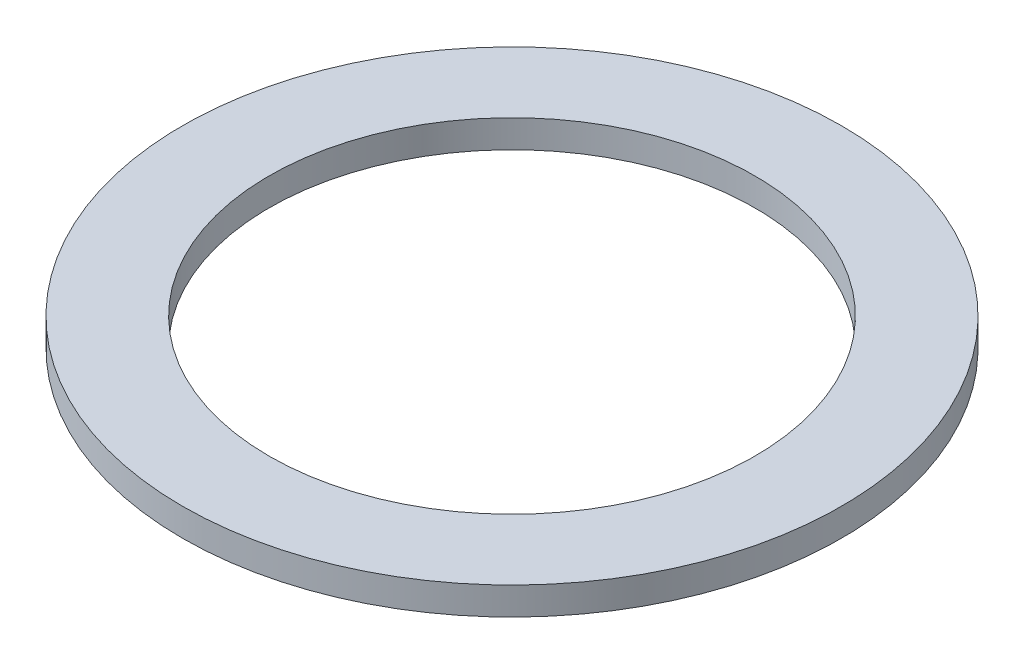
ISO-10303-21;
HEADER;
FILE_DESCRIPTION(('STEP AP214'),'2;1');
FILE_NAME('part.step','',(''),(''),'','','');
FILE_SCHEMA(('AUTOMOTIVE_DESIGN { 1 0 10303 214 1 1 1 1 }'));
ENDSEC;
DATA;
#1=APPLICATION_CONTEXT('core data for automotive mechanical design processes');
#2=APPLICATION_PROTOCOL_DEFINITION('international standard','automotive_design',2000,#1);
#3=PRODUCT_CONTEXT('',#1,'mechanical');
#4=PRODUCT('Part','Part','',(#3));
#5=PRODUCT_RELATED_PRODUCT_CATEGORY('part','',(#4));
#6=PRODUCT_DEFINITION_FORMATION('','',#4);
#7=PRODUCT_DEFINITION_CONTEXT('part definition',#1,'design');
#8=PRODUCT_DEFINITION('design','',#6,#7);
#9=PRODUCT_DEFINITION_SHAPE('','',#8);
#10=(LENGTH_UNIT() NAMED_UNIT(*) SI_UNIT(.MILLI.,.METRE.));
#11=(NAMED_UNIT(*) PLANE_ANGLE_UNIT() SI_UNIT($,.RADIAN.));
#12=(NAMED_UNIT(*) SI_UNIT($,.STERADIAN.) SOLID_ANGLE_UNIT());
#13=UNCERTAINTY_MEASURE_WITH_UNIT(LENGTH_MEASURE(1.E-05),#10,'distance_accuracy_value','');
#14=(GEOMETRIC_REPRESENTATION_CONTEXT(3) GLOBAL_UNCERTAINTY_ASSIGNED_CONTEXT((#13)) GLOBAL_UNIT_ASSIGNED_CONTEXT((#10,
#11,#12)) REPRESENTATION_CONTEXT('',''));
#15=CARTESIAN_POINT('',(0.,0.,0.));
#16=DIRECTION('',(0.,0.,1.));
#17=DIRECTION('',(1.,0.,0.));
#18=AXIS2_PLACEMENT_3D('',#15,#16,#17);
#19=CARTESIAN_POINT('',(0.,4.,0.));
#20=DIRECTION('',(0.,1.,0.));
#21=DIRECTION('',(0.,0.,1.));
#22=AXIS2_PLACEMENT_3D('',#19,#20,#21);
#23=PLANE('',#22);
#24=CARTESIAN_POINT('',(0.,4.,0.));
#25=DIRECTION('',(0.,1.,0.));
#26=DIRECTION('',(0.,0.,1.));
#27=AXIS2_PLACEMENT_3D('',#24,#25,#26);
#28=CIRCLE('',#27,47.5);
#29=CARTESIAN_POINT('',(0.,4.,47.5));
#30=VERTEX_POINT('',#29);
#31=EDGE_CURVE('E10',#30,#30,#28,.T.);
#32=ORIENTED_EDGE('',*,*,#31,.T.);
#33=EDGE_LOOP('',(#32));
#34=FACE_BOUND('',#33,.T.);
#35=CARTESIAN_POINT('',(0.,4.,0.));
#36=DIRECTION('',(0.,1.,0.));
#37=DIRECTION('',(0.,0.,1.));
#38=AXIS2_PLACEMENT_3D('',#35,#36,#37);
#39=CIRCLE('',#38,35.);
#40=CARTESIAN_POINT('',(0.,4.,35.));
#41=VERTEX_POINT('',#40);
#42=EDGE_CURVE('E43',#41,#41,#39,.T.);
#43=ORIENTED_EDGE('',*,*,#42,.F.);
#44=EDGE_LOOP('',(#43));
#45=FACE_BOUND('',#44,.T.);
#46=ADVANCED_FACE('F32',(#34,#45),#23,.T.);
#47=CARTESIAN_POINT('',(0.,0.,0.));
#48=DIRECTION('',(0.,1.,0.));
#49=DIRECTION('',(0.,0.,1.));
#50=AXIS2_PLACEMENT_3D('',#47,#48,#49);
#51=PLANE('',#50);
#52=CARTESIAN_POINT('',(0.,0.,0.));
#53=DIRECTION('',(0.,1.,0.));
#54=DIRECTION('',(0.,0.,1.));
#55=AXIS2_PLACEMENT_3D('',#52,#53,#54);
#56=CIRCLE('',#55,47.5);
#57=CARTESIAN_POINT('',(0.,0.,47.5));
#58=VERTEX_POINT('',#57);
#59=EDGE_CURVE('E36',#58,#58,#56,.T.);
#60=ORIENTED_EDGE('',*,*,#59,.F.);
#61=EDGE_LOOP('',(#60));
#62=FACE_BOUND('',#61,.T.);
#63=CARTESIAN_POINT('',(0.,0.,0.));
#64=DIRECTION('',(0.,1.,0.));
#65=DIRECTION('',(0.,0.,1.));
#66=AXIS2_PLACEMENT_3D('',#63,#64,#65);
#67=CIRCLE('',#66,35.);
#68=CARTESIAN_POINT('',(0.,0.,35.));
#69=VERTEX_POINT('',#68);
#70=EDGE_CURVE('E45',#69,#69,#67,.T.);
#71=ORIENTED_EDGE('',*,*,#70,.T.);
#72=EDGE_LOOP('',(#71));
#73=FACE_BOUND('',#72,.T.);
#74=ADVANCED_FACE('F55',(#62,#73),#51,.F.);
#75=CARTESIAN_POINT('',(0.,4.,0.));
#76=DIRECTION('',(0.,-1.,0.));
#77=DIRECTION('',(0.,0.,-1.));
#78=AXIS2_PLACEMENT_3D('',#75,#76,#77);
#79=CYLINDRICAL_SURFACE('',#78,47.5);
#80=ORIENTED_EDGE('',*,*,#31,.F.);
#81=EDGE_LOOP('',(#80));
#82=FACE_BOUND('',#81,.T.);
#83=ORIENTED_EDGE('',*,*,#59,.T.);
#84=EDGE_LOOP('',(#83));
#85=FACE_BOUND('',#84,.T.);
#86=ADVANCED_FACE('F34',(#82,#85),#79,.T.);
#87=CARTESIAN_POINT('',(0.,4.,0.));
#88=DIRECTION('',(0.,-1.,0.));
#89=DIRECTION('',(0.,0.,-1.));
#90=AXIS2_PLACEMENT_3D('',#87,#88,#89);
#91=CYLINDRICAL_SURFACE('',#90,35.);
#92=ORIENTED_EDGE('',*,*,#42,.T.);
#93=EDGE_LOOP('',(#92));
#94=FACE_BOUND('',#93,.T.);
#95=ORIENTED_EDGE('',*,*,#70,.F.);
#96=EDGE_LOOP('',(#95));
#97=FACE_BOUND('',#96,.T.);
#98=ADVANCED_FACE('F51',(#94,#97),#91,.F.);
#99=CLOSED_SHELL('',(#46,#74,#86,#98));
#100=MANIFOLD_SOLID_BREP('B2',#99);
#101=ADVANCED_BREP_SHAPE_REPRESENTATION('',(#18,#100),#14);
#102=SHAPE_DEFINITION_REPRESENTATION(#9,#101);
ENDSEC;
END-ISO-10303-21;
